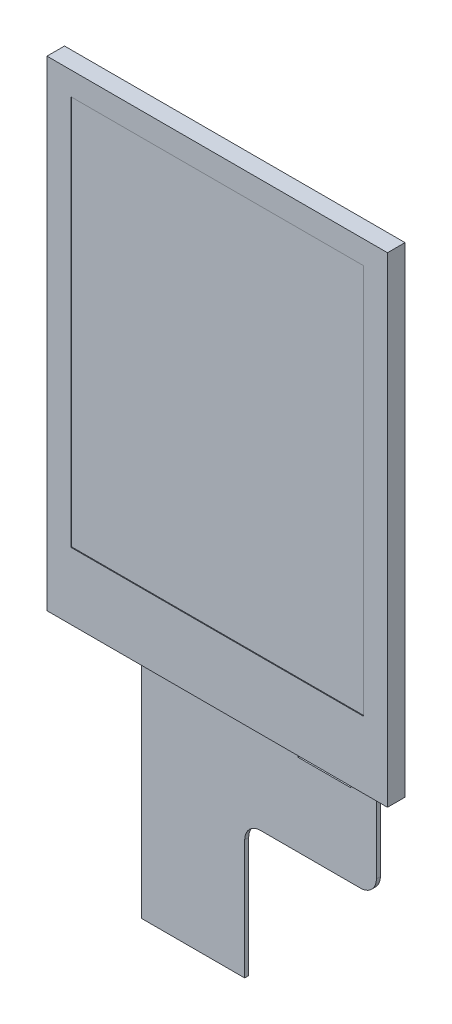
ISO-10303-21;
HEADER;
FILE_DESCRIPTION(('STEP AP214'),'2;1');
FILE_NAME('part.step','',(''),(''),'','','');
FILE_SCHEMA(('AUTOMOTIVE_DESIGN { 1 0 10303 214 1 1 1 1 }'));
ENDSEC;
DATA;
#1=APPLICATION_CONTEXT('core data for automotive mechanical design processes');
#2=APPLICATION_PROTOCOL_DEFINITION('international standard','automotive_design',2000,#1);
#3=PRODUCT_CONTEXT('',#1,'mechanical');
#4=PRODUCT('Part','Part','',(#3));
#5=PRODUCT_RELATED_PRODUCT_CATEGORY('part','',(#4));
#6=PRODUCT_DEFINITION_FORMATION('','',#4);
#7=PRODUCT_DEFINITION_CONTEXT('part definition',#1,'design');
#8=PRODUCT_DEFINITION('design','',#6,#7);
#9=PRODUCT_DEFINITION_SHAPE('','',#8);
#10=(LENGTH_UNIT() NAMED_UNIT(*) SI_UNIT(.MILLI.,.METRE.));
#11=(NAMED_UNIT(*) PLANE_ANGLE_UNIT() SI_UNIT($,.RADIAN.));
#12=(NAMED_UNIT(*) SI_UNIT($,.STERADIAN.) SOLID_ANGLE_UNIT());
#13=UNCERTAINTY_MEASURE_WITH_UNIT(LENGTH_MEASURE(1.E-05),#10,'distance_accuracy_value','');
#14=(GEOMETRIC_REPRESENTATION_CONTEXT(3) GLOBAL_UNCERTAINTY_ASSIGNED_CONTEXT((#13)) GLOBAL_UNIT_ASSIGNED_CONTEXT((#10,
#11,#12)) REPRESENTATION_CONTEXT('',''));
#15=CARTESIAN_POINT('',(0.,0.,0.));
#16=DIRECTION('',(0.,0.,1.));
#17=DIRECTION('',(1.,0.,0.));
#18=AXIS2_PLACEMENT_3D('',#15,#16,#17);
#19=CARTESIAN_POINT('',(-21.36,-30.13,2.2));
#20=DIRECTION('',(0.,1.,0.));
#21=DIRECTION('',(0.,0.,1.));
#22=AXIS2_PLACEMENT_3D('',#19,#20,#21);
#23=PLANE('',#22);
#24=DIRECTION('',(1.,0.,0.));
#25=VECTOR('',#24,1.);
#26=CARTESIAN_POINT('',(-21.36,-30.13,0.));
#27=LINE('',#26,#25);
#28=CARTESIAN_POINT('',(-21.36,-30.13,0.));
#29=VERTEX_POINT('',#28);
#30=CARTESIAN_POINT('',(21.36,-30.13,0.));
#31=VERTEX_POINT('',#30);
#32=EDGE_CURVE('E260',#29,#31,#27,.T.);
#33=ORIENTED_EDGE('',*,*,#32,.T.);
#34=DIRECTION('',(0.,0.,-1.));
#35=VECTOR('',#34,1.);
#36=CARTESIAN_POINT('',(21.36,-30.13,2.2));
#37=LINE('',#36,#35);
#38=CARTESIAN_POINT('',(21.36,-30.13,2.2));
#39=VERTEX_POINT('',#38);
#40=EDGE_CURVE('E266',#39,#31,#37,.T.);
#41=ORIENTED_EDGE('',*,*,#40,.F.);
#42=DIRECTION('',(1.,0.,0.));
#43=VECTOR('',#42,1.);
#44=CARTESIAN_POINT('',(-21.36,-30.13,2.2));
#45=LINE('',#44,#43);
#46=CARTESIAN_POINT('',(-21.36,-30.13,2.2));
#47=VERTEX_POINT('',#46);
#48=EDGE_CURVE('E264',#47,#39,#45,.T.);
#49=ORIENTED_EDGE('',*,*,#48,.F.);
#50=DIRECTION('',(0.,0.,-1.));
#51=VECTOR('',#50,1.);
#52=CARTESIAN_POINT('',(-21.36,-30.13,2.2));
#53=LINE('',#52,#51);
#54=EDGE_CURVE('E276',#47,#29,#53,.T.);
#55=ORIENTED_EDGE('',*,*,#54,.T.);
#56=EDGE_LOOP('',(#33,#41,#49,#55));
#57=FACE_BOUND('',#56,.T.);
#58=DIRECTION('',(0.,0.,1.));
#59=VECTOR('',#58,1.);
#60=CARTESIAN_POINT('',(8.66081500265931,-30.13,-44.2));
#61=LINE('',#60,#59);
#62=CARTESIAN_POINT('',(8.6608150026593,-30.13,0.2));
#63=VERTEX_POINT('',#62);
#64=CARTESIAN_POINT('',(8.66081500265931,-30.13,0.7));
#65=VERTEX_POINT('',#64);
#66=EDGE_CURVE('E174',#63,#65,#61,.T.);
#67=ORIENTED_EDGE('',*,*,#66,.F.);
#68=DIRECTION('',(1.,0.,0.));
#69=VECTOR('',#68,1.);
#70=CARTESIAN_POINT('',(-11.,-30.13,0.2));
#71=LINE('',#70,#69);
#72=CARTESIAN_POINT('',(-11.,-30.13,0.2));
#73=VERTEX_POINT('',#72);
#74=EDGE_CURVE('E209',#73,#63,#71,.T.);
#75=ORIENTED_EDGE('',*,*,#74,.F.);
#76=DIRECTION('',(0.,0.,-1.));
#77=VECTOR('',#76,1.);
#78=CARTESIAN_POINT('',(-11.,-30.13,0.2));
#79=LINE('',#78,#77);
#80=CARTESIAN_POINT('',(-11.,-30.13,0.7));
#81=VERTEX_POINT('',#80);
#82=EDGE_CURVE('E201',#81,#73,#79,.T.);
#83=ORIENTED_EDGE('',*,*,#82,.F.);
#84=DIRECTION('',(-1.,0.,0.));
#85=VECTOR('',#84,1.);
#86=CARTESIAN_POINT('',(-11.,-30.13,0.7));
#87=LINE('',#86,#85);
#88=EDGE_CURVE('E192',#65,#81,#87,.T.);
#89=ORIENTED_EDGE('',*,*,#88,.F.);
#90=EDGE_LOOP('',(#67,#75,#83,#89));
#91=FACE_BOUND('',#90,.T.);
#92=CARTESIAN_POINT('',(15.2834280516831,-30.13,0.199999999999999));
#93=VERTEX_POINT('',#92);
#94=CARTESIAN_POINT('',(18.4645953211621,-30.13,0.2));
#95=VERTEX_POINT('',#94);
#96=EDGE_CURVE('E329',#93,#95,#71,.T.);
#97=ORIENTED_EDGE('',*,*,#96,.F.);
#98=DIRECTION('',(0.,0.,1.));
#99=VECTOR('',#98,1.);
#100=CARTESIAN_POINT('',(15.2834280516831,-30.13,-44.2));
#101=LINE('',#100,#99);
#102=CARTESIAN_POINT('',(15.2834280516831,-30.13,0.7));
#103=VERTEX_POINT('',#102);
#104=EDGE_CURVE('E186',#93,#103,#101,.T.);
#105=ORIENTED_EDGE('',*,*,#104,.T.);
#106=CARTESIAN_POINT('',(18.4645953211621,-30.13,0.7));
#107=VERTEX_POINT('',#106);
#108=EDGE_CURVE('E203',#107,#103,#87,.T.);
#109=ORIENTED_EDGE('',*,*,#108,.F.);
#110=DIRECTION('',(0.,0.,1.));
#111=VECTOR('',#110,1.);
#112=CARTESIAN_POINT('',(18.4645953211621,-30.13,0.2));
#113=LINE('',#112,#111);
#114=EDGE_CURVE('E204',#95,#107,#113,.T.);
#115=ORIENTED_EDGE('',*,*,#114,.F.);
#116=EDGE_LOOP('',(#97,#105,#109,#115));
#117=FACE_BOUND('',#116,.T.);
#118=ADVANCED_FACE('F37',(#57,#91,#117),#23,.F.);
#119=CARTESIAN_POINT('',(21.36,-30.13,2.2));
#120=DIRECTION('',(-1.,0.,0.));
#121=DIRECTION('',(0.,0.,1.));
#122=AXIS2_PLACEMENT_3D('',#119,#120,#121);
#123=PLANE('',#122);
#124=DIRECTION('',(0.,1.,0.));
#125=VECTOR('',#124,1.);
#126=CARTESIAN_POINT('',(21.36,-30.13,0.));
#127=LINE('',#126,#125);
#128=CARTESIAN_POINT('',(21.36,30.13,0.));
#129=VERTEX_POINT('',#128);
#130=EDGE_CURVE('E249',#31,#129,#127,.T.);
#131=ORIENTED_EDGE('',*,*,#130,.T.);
#132=DIRECTION('',(0.,0.,-1.));
#133=VECTOR('',#132,1.);
#134=CARTESIAN_POINT('',(21.36,30.13,2.2));
#135=LINE('',#134,#133);
#136=CARTESIAN_POINT('',(21.36,30.13,2.2));
#137=VERTEX_POINT('',#136);
#138=EDGE_CURVE('E282',#137,#129,#135,.T.);
#139=ORIENTED_EDGE('',*,*,#138,.F.);
#140=DIRECTION('',(0.,1.,0.));
#141=VECTOR('',#140,1.);
#142=CARTESIAN_POINT('',(21.36,-30.13,2.2));
#143=LINE('',#142,#141);
#144=EDGE_CURVE('E256',#39,#137,#143,.T.);
#145=ORIENTED_EDGE('',*,*,#144,.F.);
#146=ORIENTED_EDGE('',*,*,#40,.T.);
#147=EDGE_LOOP('',(#131,#139,#145,#146));
#148=FACE_BOUND('',#147,.T.);
#149=ADVANCED_FACE('F351',(#148),#123,.F.);
#150=CARTESIAN_POINT('',(-21.36,30.13,2.2));
#151=DIRECTION('',(0.,-1.,0.));
#152=DIRECTION('',(0.,0.,-1.));
#153=AXIS2_PLACEMENT_3D('',#150,#151,#152);
#154=PLANE('',#153);
#155=DIRECTION('',(-1.,0.,0.));
#156=VECTOR('',#155,1.);
#157=CARTESIAN_POINT('',(-21.36,30.13,0.));
#158=LINE('',#157,#156);
#159=CARTESIAN_POINT('',(-21.36,30.13,0.));
#160=VERTEX_POINT('',#159);
#161=EDGE_CURVE('E269',#129,#160,#158,.T.);
#162=ORIENTED_EDGE('',*,*,#161,.T.);
#163=DIRECTION('',(0.,0.,-1.));
#164=VECTOR('',#163,1.);
#165=CARTESIAN_POINT('',(-21.36,30.13,2.2));
#166=LINE('',#165,#164);
#167=CARTESIAN_POINT('',(-21.36,30.13,2.2));
#168=VERTEX_POINT('',#167);
#169=EDGE_CURVE('E279',#168,#160,#166,.T.);
#170=ORIENTED_EDGE('',*,*,#169,.F.);
#171=DIRECTION('',(-1.,0.,0.));
#172=VECTOR('',#171,1.);
#173=CARTESIAN_POINT('',(-21.36,30.13,2.2));
#174=LINE('',#173,#172);
#175=EDGE_CURVE('E259',#137,#168,#174,.T.);
#176=ORIENTED_EDGE('',*,*,#175,.F.);
#177=ORIENTED_EDGE('',*,*,#138,.T.);
#178=EDGE_LOOP('',(#162,#170,#176,#177));
#179=FACE_BOUND('',#178,.T.);
#180=ADVANCED_FACE('F357',(#179),#154,.F.);
#181=CARTESIAN_POINT('',(-21.36,-30.13,2.2));
#182=DIRECTION('',(1.,0.,0.));
#183=DIRECTION('',(0.,0.,-1.));
#184=AXIS2_PLACEMENT_3D('',#181,#182,#183);
#185=PLANE('',#184);
#186=DIRECTION('',(0.,-1.,0.));
#187=VECTOR('',#186,1.);
#188=CARTESIAN_POINT('',(-21.36,-30.13,0.));
#189=LINE('',#188,#187);
#190=EDGE_CURVE('E271',#160,#29,#189,.T.);
#191=ORIENTED_EDGE('',*,*,#190,.T.);
#192=ORIENTED_EDGE('',*,*,#54,.F.);
#193=DIRECTION('',(0.,-1.,0.));
#194=VECTOR('',#193,1.);
#195=CARTESIAN_POINT('',(-21.36,-30.13,2.2));
#196=LINE('',#195,#194);
#197=EDGE_CURVE('E262',#168,#47,#196,.T.);
#198=ORIENTED_EDGE('',*,*,#197,.F.);
#199=ORIENTED_EDGE('',*,*,#169,.T.);
#200=EDGE_LOOP('',(#191,#192,#198,#199));
#201=FACE_BOUND('',#200,.T.);
#202=ADVANCED_FACE('F363',(#201),#185,.F.);
#203=CARTESIAN_POINT('',(0.,0.,2.2));
#204=DIRECTION('',(0.,0.,-1.));
#205=DIRECTION('',(-1.,0.,0.));
#206=AXIS2_PLACEMENT_3D('',#203,#204,#205);
#207=PLANE('',#206);
#208=DIRECTION('',(-1.,0.,0.));
#209=VECTOR('',#208,1.);
#210=CARTESIAN_POINT('',(-18.36,27.22,2.2));
#211=LINE('',#210,#209);
#212=CARTESIAN_POINT('',(18.36,27.22,2.2));
#213=VERTEX_POINT('',#212);
#214=CARTESIAN_POINT('',(-18.36,27.22,2.2));
#215=VERTEX_POINT('',#214);
#216=EDGE_CURVE('E239',#213,#215,#211,.T.);
#217=ORIENTED_EDGE('',*,*,#216,.F.);
#218=DIRECTION('',(0.,1.,0.));
#219=VECTOR('',#218,1.);
#220=CARTESIAN_POINT('',(18.36,27.22,2.2));
#221=LINE('',#220,#219);
#222=CARTESIAN_POINT('',(18.36,-21.74,2.2));
#223=VERTEX_POINT('',#222);
#224=EDGE_CURVE('E223',#223,#213,#221,.T.);
#225=ORIENTED_EDGE('',*,*,#224,.F.);
#226=DIRECTION('',(1.,0.,0.));
#227=VECTOR('',#226,1.);
#228=CARTESIAN_POINT('',(-18.36,-21.74,2.2));
#229=LINE('',#228,#227);
#230=CARTESIAN_POINT('',(-18.36,-21.74,2.2));
#231=VERTEX_POINT('',#230);
#232=EDGE_CURVE('E228',#231,#223,#229,.T.);
#233=ORIENTED_EDGE('',*,*,#232,.F.);
#234=DIRECTION('',(0.,-1.,0.));
#235=VECTOR('',#234,1.);
#236=CARTESIAN_POINT('',(-18.36,27.22,2.2));
#237=LINE('',#236,#235);
#238=EDGE_CURVE('E242',#215,#231,#237,.T.);
#239=ORIENTED_EDGE('',*,*,#238,.F.);
#240=EDGE_LOOP('',(#217,#225,#233,#239));
#241=FACE_BOUND('',#240,.T.);
#242=ORIENTED_EDGE('',*,*,#144,.T.);
#243=ORIENTED_EDGE('',*,*,#175,.T.);
#244=ORIENTED_EDGE('',*,*,#197,.T.);
#245=ORIENTED_EDGE('',*,*,#48,.T.);
#246=EDGE_LOOP('',(#242,#243,#244,#245));
#247=FACE_BOUND('',#246,.T.);
#248=ADVANCED_FACE('F366',(#241,#247),#207,.F.);
#249=CARTESIAN_POINT('',(0.,0.,0.));
#250=DIRECTION('',(0.,0.,-1.));
#251=DIRECTION('',(-1.,0.,0.));
#252=AXIS2_PLACEMENT_3D('',#249,#250,#251);
#253=PLANE('',#252);
#254=ORIENTED_EDGE('',*,*,#130,.F.);
#255=ORIENTED_EDGE('',*,*,#32,.F.);
#256=ORIENTED_EDGE('',*,*,#190,.F.);
#257=ORIENTED_EDGE('',*,*,#161,.F.);
#258=EDGE_LOOP('',(#254,#255,#256,#257));
#259=FACE_BOUND('',#258,.T.);
#260=ADVANCED_FACE('F361',(#259),#253,.T.);
#261=CARTESIAN_POINT('',(18.36,27.22,2.1));
#262=DIRECTION('',(1.,0.,0.));
#263=DIRECTION('',(0.,1.,0.));
#264=AXIS2_PLACEMENT_3D('',#261,#262,#263);
#265=PLANE('',#264);
#266=ORIENTED_EDGE('',*,*,#224,.T.);
#267=DIRECTION('',(0.,0.,1.));
#268=VECTOR('',#267,1.);
#269=CARTESIAN_POINT('',(18.36,27.22,2.1));
#270=LINE('',#269,#268);
#271=CARTESIAN_POINT('',(18.36,27.22,2.1));
#272=VERTEX_POINT('',#271);
#273=EDGE_CURVE('E237',#272,#213,#270,.T.);
#274=ORIENTED_EDGE('',*,*,#273,.F.);
#275=DIRECTION('',(0.,1.,0.));
#276=VECTOR('',#275,1.);
#277=CARTESIAN_POINT('',(18.36,27.22,2.1));
#278=LINE('',#277,#276);
#279=CARTESIAN_POINT('',(18.36,-21.74,2.1));
#280=VERTEX_POINT('',#279);
#281=EDGE_CURVE('E224',#280,#272,#278,.T.);
#282=ORIENTED_EDGE('',*,*,#281,.F.);
#283=DIRECTION('',(0.,0.,1.));
#284=VECTOR('',#283,1.);
#285=CARTESIAN_POINT('',(18.36,-21.74,2.1));
#286=LINE('',#285,#284);
#287=EDGE_CURVE('E247',#280,#223,#286,.T.);
#288=ORIENTED_EDGE('',*,*,#287,.T.);
#289=EDGE_LOOP('',(#266,#274,#282,#288));
#290=FACE_BOUND('',#289,.T.);
#291=ADVANCED_FACE('F389',(#290),#265,.F.);
#292=CARTESIAN_POINT('',(-18.36,-21.74,2.1));
#293=DIRECTION('',(0.,-1.,0.));
#294=DIRECTION('',(0.,0.,-1.));
#295=AXIS2_PLACEMENT_3D('',#292,#293,#294);
#296=PLANE('',#295);
#297=ORIENTED_EDGE('',*,*,#232,.T.);
#298=ORIENTED_EDGE('',*,*,#287,.F.);
#299=DIRECTION('',(1.,0.,0.));
#300=VECTOR('',#299,1.);
#301=CARTESIAN_POINT('',(-18.36,-21.74,2.1));
#302=LINE('',#301,#300);
#303=CARTESIAN_POINT('',(-18.36,-21.74,2.1));
#304=VERTEX_POINT('',#303);
#305=EDGE_CURVE('E234',#304,#280,#302,.T.);
#306=ORIENTED_EDGE('',*,*,#305,.F.);
#307=DIRECTION('',(0.,0.,1.));
#308=VECTOR('',#307,1.);
#309=CARTESIAN_POINT('',(-18.36,-21.74,2.1));
#310=LINE('',#309,#308);
#311=EDGE_CURVE('E250',#304,#231,#310,.T.);
#312=ORIENTED_EDGE('',*,*,#311,.T.);
#313=EDGE_LOOP('',(#297,#298,#306,#312));
#314=FACE_BOUND('',#313,.T.);
#315=ADVANCED_FACE('F394',(#314),#296,.F.);
#316=CARTESIAN_POINT('',(-18.36,27.22,2.1));
#317=DIRECTION('',(-1.,0.,0.));
#318=DIRECTION('',(0.,-1.,0.));
#319=AXIS2_PLACEMENT_3D('',#316,#317,#318);
#320=PLANE('',#319);
#321=ORIENTED_EDGE('',*,*,#238,.T.);
#322=ORIENTED_EDGE('',*,*,#311,.F.);
#323=DIRECTION('',(0.,-1.,0.));
#324=VECTOR('',#323,1.);
#325=CARTESIAN_POINT('',(-18.36,27.22,2.1));
#326=LINE('',#325,#324);
#327=CARTESIAN_POINT('',(-18.36,27.22,2.1));
#328=VERTEX_POINT('',#327);
#329=EDGE_CURVE('E231',#328,#304,#326,.T.);
#330=ORIENTED_EDGE('',*,*,#329,.F.);
#331=DIRECTION('',(0.,0.,1.));
#332=VECTOR('',#331,1.);
#333=CARTESIAN_POINT('',(-18.36,27.22,2.1));
#334=LINE('',#333,#332);
#335=EDGE_CURVE('E252',#328,#215,#334,.T.);
#336=ORIENTED_EDGE('',*,*,#335,.T.);
#337=EDGE_LOOP('',(#321,#322,#330,#336));
#338=FACE_BOUND('',#337,.T.);
#339=ADVANCED_FACE('F400',(#338),#320,.F.);
#340=CARTESIAN_POINT('',(-18.36,27.22,2.1));
#341=DIRECTION('',(0.,1.,0.));
#342=DIRECTION('',(0.,0.,1.));
#343=AXIS2_PLACEMENT_3D('',#340,#341,#342);
#344=PLANE('',#343);
#345=ORIENTED_EDGE('',*,*,#216,.T.);
#346=ORIENTED_EDGE('',*,*,#335,.F.);
#347=DIRECTION('',(-1.,0.,0.));
#348=VECTOR('',#347,1.);
#349=CARTESIAN_POINT('',(-18.36,27.22,2.1));
#350=LINE('',#349,#348);
#351=EDGE_CURVE('E227',#272,#328,#350,.T.);
#352=ORIENTED_EDGE('',*,*,#351,.F.);
#353=ORIENTED_EDGE('',*,*,#273,.T.);
#354=EDGE_LOOP('',(#345,#346,#352,#353));
#355=FACE_BOUND('',#354,.T.);
#356=ADVANCED_FACE('F396',(#355),#344,.F.);
#357=CARTESIAN_POINT('',(0.,0.,2.1));
#358=DIRECTION('',(0.,0.,1.));
#359=DIRECTION('',(1.,0.,0.));
#360=AXIS2_PLACEMENT_3D('',#357,#358,#359);
#361=PLANE('',#360);
#362=ORIENTED_EDGE('',*,*,#281,.T.);
#363=ORIENTED_EDGE('',*,*,#351,.T.);
#364=ORIENTED_EDGE('',*,*,#329,.T.);
#365=ORIENTED_EDGE('',*,*,#305,.T.);
#366=EDGE_LOOP('',(#362,#363,#364,#365));
#367=FACE_BOUND('',#366,.T.);
#368=ADVANCED_FACE('F399',(#367),#361,.T.);
#369=CARTESIAN_POINT('',(-11.,-59.13,0.2));
#370=DIRECTION('',(1.,0.,0.));
#371=DIRECTION('',(0.,0.,-1.));
#372=AXIS2_PLACEMENT_3D('',#369,#370,#371);
#373=PLANE('',#372);
#374=ORIENTED_EDGE('',*,*,#82,.T.);
#375=DIRECTION('',(0.,1.,0.));
#376=VECTOR('',#375,1.);
#377=CARTESIAN_POINT('',(-11.,-59.13,0.2));
#378=LINE('',#377,#376);
#379=CARTESIAN_POINT('',(-11.,-59.13,0.2));
#380=VERTEX_POINT('',#379);
#381=EDGE_CURVE('E220',#380,#73,#378,.T.);
#382=ORIENTED_EDGE('',*,*,#381,.F.);
#383=DIRECTION('',(0.,0.,-1.));
#384=VECTOR('',#383,1.);
#385=CARTESIAN_POINT('',(-11.,-59.13,0.2));
#386=LINE('',#385,#384);
#387=CARTESIAN_POINT('',(-11.,-59.13,0.7));
#388=VERTEX_POINT('',#387);
#389=EDGE_CURVE('E207',#388,#380,#386,.T.);
#390=ORIENTED_EDGE('',*,*,#389,.F.);
#391=DIRECTION('',(0.,1.,0.));
#392=VECTOR('',#391,1.);
#393=CARTESIAN_POINT('',(-11.,-59.13,0.7));
#394=LINE('',#393,#392);
#395=EDGE_CURVE('E213',#388,#81,#394,.T.);
#396=ORIENTED_EDGE('',*,*,#395,.T.);
#397=EDGE_LOOP('',(#374,#382,#390,#396));
#398=FACE_BOUND('',#397,.T.);
#399=ADVANCED_FACE('F410',(#398),#373,.F.);
#400=CARTESIAN_POINT('',(-11.,-59.13,0.2));
#401=DIRECTION('',(0.,0.,1.));
#402=DIRECTION('',(1.,0.,0.));
#403=AXIS2_PLACEMENT_3D('',#400,#401,#402);
#404=PLANE('',#403);
#405=DIRECTION('',(0.,1.,0.));
#406=VECTOR('',#405,1.);
#407=CARTESIAN_POINT('',(18.4645953211621,-59.13,0.2));
#408=LINE('',#407,#406);
#409=CARTESIAN_POINT('',(18.4645953211621,-40.10712439942,0.2));
#410=VERTEX_POINT('',#409);
#411=EDGE_CURVE('E218',#410,#95,#408,.T.);
#412=ORIENTED_EDGE('',*,*,#411,.F.);
#413=CARTESIAN_POINT('',(16.4645953211621,-40.1071243994199,0.199999999999999));
#414=DIRECTION('',(0.,0.,1.));
#415=DIRECTION('',(1.,0.,0.));
#416=AXIS2_PLACEMENT_3D('',#413,#414,#415);
#417=CIRCLE('',#416,2.);
#418=CARTESIAN_POINT('',(16.4645953211621,-42.1071243994199,0.2));
#419=VERTEX_POINT('',#418);
#420=EDGE_CURVE('E296',#410,#419,#417,.F.);
#421=ORIENTED_EDGE('',*,*,#420,.T.);
#422=DIRECTION('',(-1.,0.,0.));
#423=VECTOR('',#422,1.);
#424=CARTESIAN_POINT('',(-11.,-42.1071243994199,0.2));
#425=LINE('',#424,#423);
#426=CARTESIAN_POINT('',(3.94622121684351,-42.1071243994199,0.2));
#427=VERTEX_POINT('',#426);
#428=EDGE_CURVE('E319',#419,#427,#425,.T.);
#429=ORIENTED_EDGE('',*,*,#428,.T.);
#430=CARTESIAN_POINT('',(3.94622121684351,-44.1071243994199,0.199999999999999));
#431=DIRECTION('',(0.,0.,1.));
#432=DIRECTION('',(1.,0.,0.));
#433=AXIS2_PLACEMENT_3D('',#430,#431,#432);
#434=CIRCLE('',#433,2.);
#435=CARTESIAN_POINT('',(1.94622121684351,-44.1071243994199,0.2));
#436=VERTEX_POINT('',#435);
#437=EDGE_CURVE('E11',#427,#436,#434,.T.);
#438=ORIENTED_EDGE('',*,*,#437,.T.);
#439=DIRECTION('',(0.,-1.,0.));
#440=VECTOR('',#439,1.);
#441=CARTESIAN_POINT('',(1.94622121684351,-59.13,0.2));
#442=LINE('',#441,#440);
#443=CARTESIAN_POINT('',(1.94622121684351,-59.13,0.199999999999999));
#444=VERTEX_POINT('',#443);
#445=EDGE_CURVE('E317',#436,#444,#442,.T.);
#446=ORIENTED_EDGE('',*,*,#445,.T.);
#447=DIRECTION('',(1.,0.,0.));
#448=VECTOR('',#447,1.);
#449=CARTESIAN_POINT('',(-11.,-59.13,0.2));
#450=LINE('',#449,#448);
#451=EDGE_CURVE('E326',#380,#444,#450,.T.);
#452=ORIENTED_EDGE('',*,*,#451,.F.);
#453=ORIENTED_EDGE('',*,*,#381,.T.);
#454=ORIENTED_EDGE('',*,*,#74,.T.);
#455=DIRECTION('',(0.,-1.,0.));
#456=VECTOR('',#455,1.);
#457=CARTESIAN_POINT('',(8.66081500265931,-59.13,0.2));
#458=LINE('',#457,#456);
#459=CARTESIAN_POINT('',(8.66081500265931,-31.8052818787163,0.199999999999999));
#460=VERTEX_POINT('',#459);
#461=EDGE_CURVE('E181',#63,#460,#458,.T.);
#462=ORIENTED_EDGE('',*,*,#461,.T.);
#463=DIRECTION('',(1.,0.,0.));
#464=VECTOR('',#463,1.);
#465=CARTESIAN_POINT('',(-11.,-31.8052818787163,0.2));
#466=LINE('',#465,#464);
#467=CARTESIAN_POINT('',(15.2834280516831,-31.8052818787163,0.199999999999999));
#468=VERTEX_POINT('',#467);
#469=EDGE_CURVE('E438',#460,#468,#466,.T.);
#470=ORIENTED_EDGE('',*,*,#469,.T.);
#471=DIRECTION('',(0.,1.,0.));
#472=VECTOR('',#471,1.);
#473=CARTESIAN_POINT('',(15.2834280516831,-59.13,0.2));
#474=LINE('',#473,#472);
#475=EDGE_CURVE('E312',#468,#93,#474,.T.);
#476=ORIENTED_EDGE('',*,*,#475,.T.);
#477=ORIENTED_EDGE('',*,*,#96,.T.);
#478=EDGE_LOOP('',(#412,#421,#429,#438,#446,#452,#453,#454,#462,#470,#476,#477));
#479=FACE_BOUND('',#478,.T.);
#480=ADVANCED_FACE('F334',(#479),#404,.F.);
#481=CARTESIAN_POINT('',(18.4645953211621,-59.13,0.2));
#482=DIRECTION('',(-1.,0.,0.));
#483=DIRECTION('',(0.,0.,1.));
#484=AXIS2_PLACEMENT_3D('',#481,#482,#483);
#485=PLANE('',#484);
#486=DIRECTION('',(0.,1.,0.));
#487=VECTOR('',#486,1.);
#488=CARTESIAN_POINT('',(18.4645953211621,-59.13,0.7));
#489=LINE('',#488,#487);
#490=CARTESIAN_POINT('',(18.4645953211621,-40.10712439942,0.7));
#491=VERTEX_POINT('',#490);
#492=EDGE_CURVE('E215',#491,#107,#489,.T.);
#493=ORIENTED_EDGE('',*,*,#492,.F.);
#494=DIRECTION('',(0.,0.,1.));
#495=VECTOR('',#494,1.);
#496=CARTESIAN_POINT('',(18.4645953211621,-40.1071243994199,0.2));
#497=LINE('',#496,#495);
#498=EDGE_CURVE('E58',#491,#410,#497,.F.);
#499=ORIENTED_EDGE('',*,*,#498,.T.);
#500=ORIENTED_EDGE('',*,*,#411,.T.);
#501=ORIENTED_EDGE('',*,*,#114,.T.);
#502=EDGE_LOOP('',(#493,#499,#500,#501));
#503=FACE_BOUND('',#502,.T.);
#504=ADVANCED_FACE('F339',(#503),#485,.F.);
#505=CARTESIAN_POINT('',(-11.,-59.13,0.7));
#506=DIRECTION('',(0.,0.,-1.));
#507=DIRECTION('',(-1.,0.,0.));
#508=AXIS2_PLACEMENT_3D('',#505,#506,#507);
#509=PLANE('',#508);
#510=DIRECTION('',(-1.,0.,0.));
#511=VECTOR('',#510,1.);
#512=CARTESIAN_POINT('',(18.4645953211621,-42.1071243994199,0.7));
#513=LINE('',#512,#511);
#514=CARTESIAN_POINT('',(16.4645953211621,-42.1071243994199,0.7));
#515=VERTEX_POINT('',#514);
#516=CARTESIAN_POINT('',(3.94622121684351,-42.1071243994199,0.7));
#517=VERTEX_POINT('',#516);
#518=EDGE_CURVE('E302',#515,#517,#513,.T.);
#519=ORIENTED_EDGE('',*,*,#518,.F.);
#520=CARTESIAN_POINT('',(16.4645953211621,-40.1071243994199,0.699999999999999));
#521=DIRECTION('',(0.,0.,-1.));
#522=DIRECTION('',(-1.,0.,0.));
#523=AXIS2_PLACEMENT_3D('',#520,#521,#522);
#524=CIRCLE('',#523,2.);
#525=EDGE_CURVE('E293',#515,#491,#524,.F.);
#526=ORIENTED_EDGE('',*,*,#525,.T.);
#527=ORIENTED_EDGE('',*,*,#492,.T.);
#528=ORIENTED_EDGE('',*,*,#108,.T.);
#529=DIRECTION('',(0.,1.,0.));
#530=VECTOR('',#529,1.);
#531=CARTESIAN_POINT('',(15.2834280516831,-30.13,0.7));
#532=LINE('',#531,#530);
#533=CARTESIAN_POINT('',(15.2834280516831,-31.8052818787163,0.7));
#534=VERTEX_POINT('',#533);
#535=EDGE_CURVE('E197',#534,#103,#532,.T.);
#536=ORIENTED_EDGE('',*,*,#535,.F.);
#537=DIRECTION('',(1.,0.,0.));
#538=VECTOR('',#537,1.);
#539=CARTESIAN_POINT('',(15.2834280516831,-31.8052818787163,0.7));
#540=LINE('',#539,#538);
#541=CARTESIAN_POINT('',(8.66081500265931,-31.8052818787163,0.7));
#542=VERTEX_POINT('',#541);
#543=EDGE_CURVE('E196',#542,#534,#540,.T.);
#544=ORIENTED_EDGE('',*,*,#543,.F.);
#545=DIRECTION('',(0.,-1.,0.));
#546=VECTOR('',#545,1.);
#547=CARTESIAN_POINT('',(8.66081500265931,-30.13,0.7));
#548=LINE('',#547,#546);
#549=EDGE_CURVE('E178',#65,#542,#548,.T.);
#550=ORIENTED_EDGE('',*,*,#549,.F.);
#551=ORIENTED_EDGE('',*,*,#88,.T.);
#552=ORIENTED_EDGE('',*,*,#395,.F.);
#553=DIRECTION('',(-1.,0.,0.));
#554=VECTOR('',#553,1.);
#555=CARTESIAN_POINT('',(-11.,-59.13,0.7));
#556=LINE('',#555,#554);
#557=CARTESIAN_POINT('',(1.94622121684351,-59.13,0.7));
#558=VERTEX_POINT('',#557);
#559=EDGE_CURVE('E216',#558,#388,#556,.T.);
#560=ORIENTED_EDGE('',*,*,#559,.F.);
#561=DIRECTION('',(0.,-1.,0.));
#562=VECTOR('',#561,1.);
#563=CARTESIAN_POINT('',(1.94622121684351,-59.13,0.7));
#564=LINE('',#563,#562);
#565=CARTESIAN_POINT('',(1.94622121684351,-44.1071243994199,0.7));
#566=VERTEX_POINT('',#565);
#567=EDGE_CURVE('E304',#566,#558,#564,.T.);
#568=ORIENTED_EDGE('',*,*,#567,.F.);
#569=CARTESIAN_POINT('',(3.94622121684351,-44.1071243994199,0.699999999999999));
#570=DIRECTION('',(0.,0.,-1.));
#571=DIRECTION('',(-1.,0.,0.));
#572=AXIS2_PLACEMENT_3D('',#569,#570,#571);
#573=CIRCLE('',#572,2.);
#574=EDGE_CURVE('E45',#566,#517,#573,.T.);
#575=ORIENTED_EDGE('',*,*,#574,.T.);
#576=EDGE_LOOP('',(#519,#526,#527,#528,#536,#544,#550,#551,#552,#560,#568,#575));
#577=FACE_BOUND('',#576,.T.);
#578=ADVANCED_FACE('F190',(#577),#509,.F.);
#579=CARTESIAN_POINT('',(0.,-59.13,0.));
#580=DIRECTION('',(0.,1.,0.));
#581=DIRECTION('',(0.,0.,1.));
#582=AXIS2_PLACEMENT_3D('',#579,#580,#581);
#583=PLANE('',#582);
#584=ORIENTED_EDGE('',*,*,#451,.T.);
#585=DIRECTION('',(0.,0.,1.));
#586=VECTOR('',#585,1.);
#587=CARTESIAN_POINT('',(1.94622121684351,-59.13,0.));
#588=LINE('',#587,#586);
#589=EDGE_CURVE('E285',#444,#558,#588,.T.);
#590=ORIENTED_EDGE('',*,*,#589,.T.);
#591=ORIENTED_EDGE('',*,*,#559,.T.);
#592=ORIENTED_EDGE('',*,*,#389,.T.);
#593=EDGE_LOOP('',(#584,#590,#591,#592));
#594=FACE_BOUND('',#593,.T.);
#595=ADVANCED_FACE('F421',(#594),#583,.F.);
#596=CARTESIAN_POINT('',(18.4645953211621,-42.1071243994199,-44.2));
#597=DIRECTION('',(0.,1.,0.));
#598=DIRECTION('',(0.,0.,1.));
#599=AXIS2_PLACEMENT_3D('',#596,#597,#598);
#600=PLANE('',#599);
#601=ORIENTED_EDGE('',*,*,#428,.F.);
#602=DIRECTION('',(0.,0.,1.));
#603=VECTOR('',#602,1.);
#604=CARTESIAN_POINT('',(16.4645953211621,-42.1071243994199,-44.2));
#605=LINE('',#604,#603);
#606=EDGE_CURVE('E290',#419,#515,#605,.T.);
#607=ORIENTED_EDGE('',*,*,#606,.T.);
#608=ORIENTED_EDGE('',*,*,#518,.T.);
#609=DIRECTION('',(0.,0.,1.));
#610=VECTOR('',#609,1.);
#611=CARTESIAN_POINT('',(3.94622121684351,-42.1071243994199,0.199999999999999));
#612=LINE('',#611,#610);
#613=EDGE_CURVE('E288',#517,#427,#612,.F.);
#614=ORIENTED_EDGE('',*,*,#613,.T.);
#615=EDGE_LOOP('',(#601,#607,#608,#614));
#616=FACE_BOUND('',#615,.T.);
#617=ADVANCED_FACE('F310',(#616),#600,.F.);
#618=CARTESIAN_POINT('',(1.94622121684351,-59.13,-44.2));
#619=DIRECTION('',(-1.,0.,0.));
#620=DIRECTION('',(0.,0.,1.));
#621=AXIS2_PLACEMENT_3D('',#618,#619,#620);
#622=PLANE('',#621);
#623=ORIENTED_EDGE('',*,*,#445,.F.);
#624=DIRECTION('',(0.,0.,1.));
#625=VECTOR('',#624,1.);
#626=CARTESIAN_POINT('',(1.94622121684351,-44.1071243994199,0.699999999999999));
#627=LINE('',#626,#625);
#628=EDGE_CURVE('E298',#436,#566,#627,.T.);
#629=ORIENTED_EDGE('',*,*,#628,.T.);
#630=ORIENTED_EDGE('',*,*,#567,.T.);
#631=ORIENTED_EDGE('',*,*,#589,.F.);
#632=EDGE_LOOP('',(#623,#629,#630,#631));
#633=FACE_BOUND('',#632,.T.);
#634=ADVANCED_FACE('F315',(#633),#622,.F.);
#635=CARTESIAN_POINT('',(15.2834280516831,-30.13,-44.2));
#636=DIRECTION('',(1.,0.,0.));
#637=DIRECTION('',(0.,0.,-1.));
#638=AXIS2_PLACEMENT_3D('',#635,#636,#637);
#639=PLANE('',#638);
#640=DIRECTION('',(0.,0.,1.));
#641=VECTOR('',#640,1.);
#642=CARTESIAN_POINT('',(15.2834280516831,-31.8052818787163,-44.2));
#643=LINE('',#642,#641);
#644=EDGE_CURVE('E439',#468,#534,#643,.T.);
#645=ORIENTED_EDGE('',*,*,#644,.T.);
#646=ORIENTED_EDGE('',*,*,#535,.T.);
#647=ORIENTED_EDGE('',*,*,#104,.F.);
#648=ORIENTED_EDGE('',*,*,#475,.F.);
#649=EDGE_LOOP('',(#645,#646,#647,#648));
#650=FACE_BOUND('',#649,.T.);
#651=ADVANCED_FACE('F429',(#650),#639,.F.);
#652=CARTESIAN_POINT('',(15.2834280516831,-31.8052818787163,-44.2));
#653=DIRECTION('',(0.,-1.,0.));
#654=DIRECTION('',(0.,0.,-1.));
#655=AXIS2_PLACEMENT_3D('',#652,#653,#654);
#656=PLANE('',#655);
#657=DIRECTION('',(0.,0.,1.));
#658=VECTOR('',#657,1.);
#659=CARTESIAN_POINT('',(8.66081500265931,-31.8052818787163,-44.2));
#660=LINE('',#659,#658);
#661=EDGE_CURVE('E185',#460,#542,#660,.T.);
#662=ORIENTED_EDGE('',*,*,#661,.T.);
#663=ORIENTED_EDGE('',*,*,#543,.T.);
#664=ORIENTED_EDGE('',*,*,#644,.F.);
#665=ORIENTED_EDGE('',*,*,#469,.F.);
#666=EDGE_LOOP('',(#662,#663,#664,#665));
#667=FACE_BOUND('',#666,.T.);
#668=ADVANCED_FACE('F347',(#667),#656,.F.);
#669=CARTESIAN_POINT('',(8.66081500265931,-30.13,-44.2));
#670=DIRECTION('',(-1.,0.,0.));
#671=DIRECTION('',(0.,0.,1.));
#672=AXIS2_PLACEMENT_3D('',#669,#670,#671);
#673=PLANE('',#672);
#674=ORIENTED_EDGE('',*,*,#66,.T.);
#675=ORIENTED_EDGE('',*,*,#549,.T.);
#676=ORIENTED_EDGE('',*,*,#661,.F.);
#677=ORIENTED_EDGE('',*,*,#461,.F.);
#678=EDGE_LOOP('',(#674,#675,#676,#677));
#679=FACE_BOUND('',#678,.T.);
#680=ADVANCED_FACE('F176',(#679),#673,.F.);
#681=CARTESIAN_POINT('',(16.4645953211621,-40.1071243994199,-44.2));
#682=DIRECTION('',(0.,0.,1.));
#683=DIRECTION('',(1.,0.,0.));
#684=AXIS2_PLACEMENT_3D('',#681,#682,#683);
#685=CYLINDRICAL_SURFACE('',#684,2.);
#686=ORIENTED_EDGE('',*,*,#420,.F.);
#687=ORIENTED_EDGE('',*,*,#498,.F.);
#688=ORIENTED_EDGE('',*,*,#525,.F.);
#689=ORIENTED_EDGE('',*,*,#606,.F.);
#690=EDGE_LOOP('',(#686,#687,#688,#689));
#691=FACE_BOUND('',#690,.T.);
#692=ADVANCED_FACE('F341',(#691),#685,.T.);
#693=CARTESIAN_POINT('',(3.94622121684351,-44.1071243994199,-44.2));
#694=DIRECTION('',(0.,0.,-1.));
#695=DIRECTION('',(-1.,0.,0.));
#696=AXIS2_PLACEMENT_3D('',#693,#694,#695);
#697=CYLINDRICAL_SURFACE('',#696,2.);
#698=ORIENTED_EDGE('',*,*,#437,.F.);
#699=ORIENTED_EDGE('',*,*,#613,.F.);
#700=ORIENTED_EDGE('',*,*,#574,.F.);
#701=ORIENTED_EDGE('',*,*,#628,.F.);
#702=EDGE_LOOP('',(#698,#699,#700,#701));
#703=FACE_BOUND('',#702,.T.);
#704=ADVANCED_FACE('F39',(#703),#697,.F.);
#705=CLOSED_SHELL('',(#118,#149,#180,#202,#248,#260,#291,#315,#339,#356,#368,#399,#480,#504,
#578,#595,#617,#634,#651,#668,#680,#692,#704));
#706=MANIFOLD_SOLID_BREP('B2',#705);
#707=ADVANCED_BREP_SHAPE_REPRESENTATION('',(#18,#706),#14);
#708=SHAPE_DEFINITION_REPRESENTATION(#9,#707);
ENDSEC;
END-ISO-10303-21;
